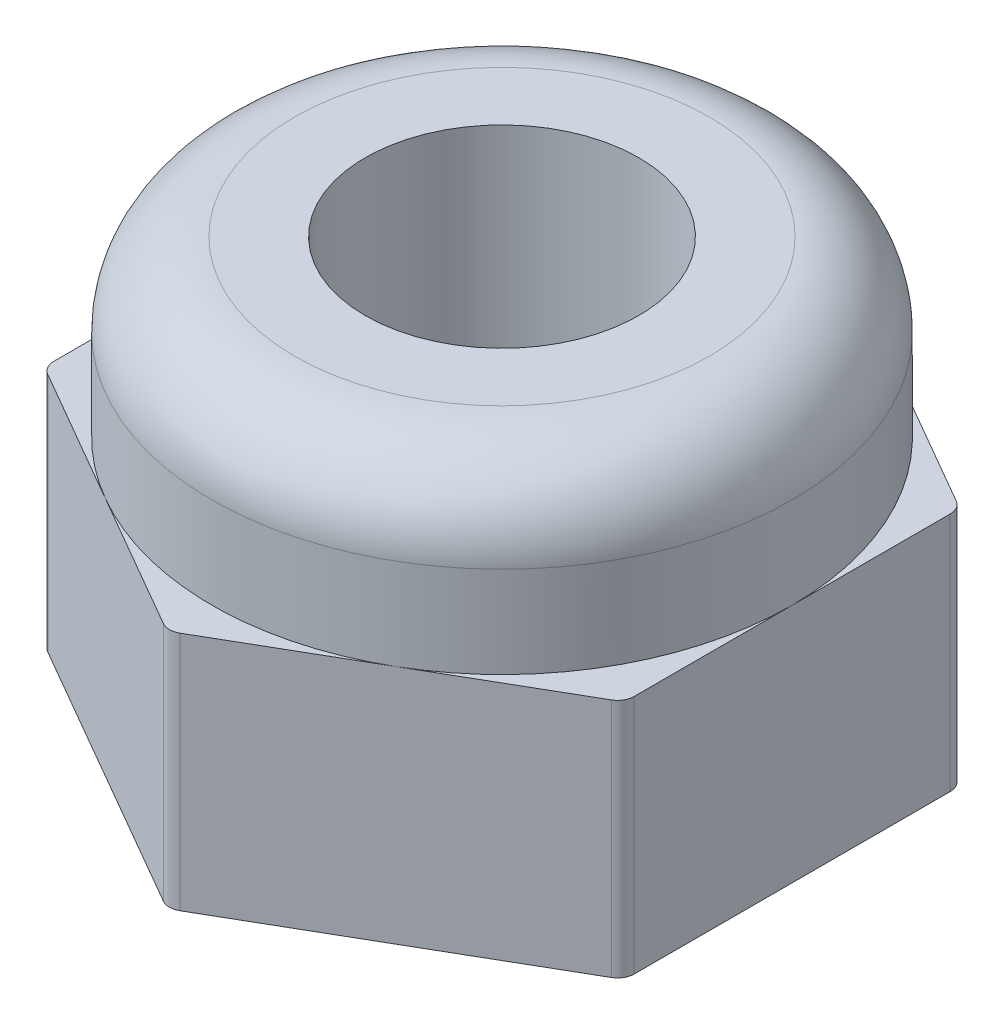
ISO-10303-21;
HEADER;
FILE_DESCRIPTION(('STEP AP214'),'2;1');
FILE_NAME('part.step','',(''),(''),'','','');
FILE_SCHEMA(('AUTOMOTIVE_DESIGN { 1 0 10303 214 1 1 1 1 }'));
ENDSEC;
DATA;
#1=APPLICATION_CONTEXT('core data for automotive mechanical design processes');
#2=APPLICATION_PROTOCOL_DEFINITION('international standard','automotive_design',2000,#1);
#3=PRODUCT_CONTEXT('',#1,'mechanical');
#4=PRODUCT('Part','Part','',(#3));
#5=PRODUCT_RELATED_PRODUCT_CATEGORY('part','',(#4));
#6=PRODUCT_DEFINITION_FORMATION('','',#4);
#7=PRODUCT_DEFINITION_CONTEXT('part definition',#1,'design');
#8=PRODUCT_DEFINITION('design','',#6,#7);
#9=PRODUCT_DEFINITION_SHAPE('','',#8);
#10=(LENGTH_UNIT() NAMED_UNIT(*) SI_UNIT(.MILLI.,.METRE.));
#11=(NAMED_UNIT(*) PLANE_ANGLE_UNIT() SI_UNIT($,.RADIAN.));
#12=(NAMED_UNIT(*) SI_UNIT($,.STERADIAN.) SOLID_ANGLE_UNIT());
#13=UNCERTAINTY_MEASURE_WITH_UNIT(LENGTH_MEASURE(1.E-05),#10,'distance_accuracy_value','');
#14=(GEOMETRIC_REPRESENTATION_CONTEXT(3) GLOBAL_UNCERTAINTY_ASSIGNED_CONTEXT((#13)) GLOBAL_UNIT_ASSIGNED_CONTEXT((#10,
#11,#12)) REPRESENTATION_CONTEXT('',''));
#15=CARTESIAN_POINT('',(0.,0.,0.));
#16=DIRECTION('',(0.,0.,1.));
#17=DIRECTION('',(1.,0.,0.));
#18=AXIS2_PLACEMENT_3D('',#15,#16,#17);
#19=CARTESIAN_POINT('',(0.,2.9,0.));
#20=DIRECTION('',(0.,1.,0.));
#21=DIRECTION('',(0.,0.,1.));
#22=AXIS2_PLACEMENT_3D('',#19,#20,#21);
#23=PLANE('',#22);
#24=DIRECTION('',(0.866025403784438,0.,-0.5));
#25=VECTOR('',#24,1.);
#26=CARTESIAN_POINT('',(0.,2.9,4.04145188432738));
#27=LINE('',#26,#25);
#28=CARTESIAN_POINT('',(1.75,2.9,3.03108891324553));
#29=VERTEX_POINT('',#28);
#30=CARTESIAN_POINT('',(3.4,2.9,2.07846096908265));
#31=VERTEX_POINT('',#30);
#32=EDGE_CURVE('E159',#29,#31,#27,.T.);
#33=ORIENTED_EDGE('',*,*,#32,.T.);
#34=CARTESIAN_POINT('',(3.3,2.9,1.90525588832576));
#35=DIRECTION('',(0.,1.,0.));
#36=DIRECTION('',(0.,0.,1.));
#37=AXIS2_PLACEMENT_3D('',#34,#35,#36);
#38=CIRCLE('',#37,0.2);
#39=CARTESIAN_POINT('',(3.5,2.9,1.90525588832576));
#40=VERTEX_POINT('',#39);
#41=EDGE_CURVE('E52',#31,#40,#38,.T.);
#42=ORIENTED_EDGE('',*,*,#41,.T.);
#43=DIRECTION('',(0.,0.,-1.));
#44=VECTOR('',#43,1.);
#45=CARTESIAN_POINT('',(3.5,2.9,2.02072594216369));
#46=LINE('',#45,#44);
#47=CARTESIAN_POINT('',(3.5,2.9,0.));
#48=VERTEX_POINT('',#47);
#49=EDGE_CURVE('E170',#40,#48,#46,.T.);
#50=ORIENTED_EDGE('',*,*,#49,.T.);
#51=CARTESIAN_POINT('',(0.,2.9,0.));
#52=DIRECTION('',(0.,1.,0.));
#53=DIRECTION('',(0.,0.,1.));
#54=AXIS2_PLACEMENT_3D('',#51,#52,#53);
#55=CIRCLE('',#54,3.5);
#56=EDGE_CURVE('E168',#29,#48,#55,.T.);
#57=ORIENTED_EDGE('',*,*,#56,.F.);
#58=EDGE_LOOP('',(#33,#42,#50,#57));
#59=FACE_BOUND('',#58,.T.);
#60=ADVANCED_FACE('F43',(#59),#23,.T.);
#61=CARTESIAN_POINT('',(3.5,2.9,-1.90525588832577));
#62=VERTEX_POINT('',#61);
#63=EDGE_CURVE('E196',#48,#62,#46,.T.);
#64=ORIENTED_EDGE('',*,*,#63,.T.);
#65=CARTESIAN_POINT('',(3.3,2.9,-1.90525588832576));
#66=DIRECTION('',(0.,1.,0.));
#67=DIRECTION('',(0.,0.,1.));
#68=AXIS2_PLACEMENT_3D('',#65,#66,#67);
#69=CIRCLE('',#68,0.2);
#70=CARTESIAN_POINT('',(3.4,2.9,-2.07846096908265));
#71=VERTEX_POINT('',#70);
#72=EDGE_CURVE('E302',#62,#71,#69,.T.);
#73=ORIENTED_EDGE('',*,*,#72,.T.);
#74=DIRECTION('',(-0.866025403784439,0.,-0.5));
#75=VECTOR('',#74,1.);
#76=CARTESIAN_POINT('',(3.5,2.9,-2.02072594216369));
#77=LINE('',#76,#75);
#78=CARTESIAN_POINT('',(1.75,2.9,-3.03108891324554));
#79=VERTEX_POINT('',#78);
#80=EDGE_CURVE('E197',#71,#79,#77,.T.);
#81=ORIENTED_EDGE('',*,*,#80,.T.);
#82=EDGE_CURVE('E176',#48,#79,#55,.T.);
#83=ORIENTED_EDGE('',*,*,#82,.F.);
#84=EDGE_LOOP('',(#64,#73,#81,#83));
#85=FACE_BOUND('',#84,.T.);
#86=ADVANCED_FACE('F366',(#85),#23,.T.);
#87=CARTESIAN_POINT('',(0.0999999999999985,2.9,-3.98371685740842));
#88=VERTEX_POINT('',#87);
#89=EDGE_CURVE('E195',#79,#88,#77,.T.);
#90=ORIENTED_EDGE('',*,*,#89,.T.);
#91=CARTESIAN_POINT('',(0.,2.9,-3.81051177665153));
#92=DIRECTION('',(0.,1.,0.));
#93=DIRECTION('',(0.,0.,1.));
#94=AXIS2_PLACEMENT_3D('',#91,#92,#93);
#95=CIRCLE('',#94,0.2);
#96=CARTESIAN_POINT('',(-0.100000000000001,2.9,-3.98371685740842));
#97=VERTEX_POINT('',#96);
#98=EDGE_CURVE('E292',#88,#97,#95,.T.);
#99=ORIENTED_EDGE('',*,*,#98,.T.);
#100=DIRECTION('',(-0.866025403784438,0.,0.5));
#101=VECTOR('',#100,1.);
#102=CARTESIAN_POINT('',(0.,2.9,-4.04145188432738));
#103=LINE('',#102,#101);
#104=CARTESIAN_POINT('',(-1.75,2.9,-3.03108891324553));
#105=VERTEX_POINT('',#104);
#106=EDGE_CURVE('E201',#97,#105,#103,.T.);
#107=ORIENTED_EDGE('',*,*,#106,.T.);
#108=EDGE_CURVE('E371',#79,#105,#55,.T.);
#109=ORIENTED_EDGE('',*,*,#108,.F.);
#110=EDGE_LOOP('',(#90,#99,#107,#109));
#111=FACE_BOUND('',#110,.T.);
#112=ADVANCED_FACE('F381',(#111),#23,.T.);
#113=CARTESIAN_POINT('',(-3.4,2.9,-2.07846096908265));
#114=VERTEX_POINT('',#113);
#115=EDGE_CURVE('E200',#105,#114,#103,.T.);
#116=ORIENTED_EDGE('',*,*,#115,.T.);
#117=CARTESIAN_POINT('',(-3.3,2.9,-1.90525588832576));
#118=DIRECTION('',(0.,1.,0.));
#119=DIRECTION('',(0.,0.,1.));
#120=AXIS2_PLACEMENT_3D('',#117,#118,#119);
#121=CIRCLE('',#120,0.2);
#122=CARTESIAN_POINT('',(-3.5,2.9,-1.90525588832576));
#123=VERTEX_POINT('',#122);
#124=EDGE_CURVE('E282',#114,#123,#121,.T.);
#125=ORIENTED_EDGE('',*,*,#124,.T.);
#126=DIRECTION('',(0.,0.,1.));
#127=VECTOR('',#126,1.);
#128=CARTESIAN_POINT('',(-3.5,2.9,-2.02072594216369));
#129=LINE('',#128,#127);
#130=CARTESIAN_POINT('',(-3.5,2.9,0.));
#131=VERTEX_POINT('',#130);
#132=EDGE_CURVE('E205',#123,#131,#129,.T.);
#133=ORIENTED_EDGE('',*,*,#132,.T.);
#134=EDGE_CURVE('E187',#105,#131,#55,.T.);
#135=ORIENTED_EDGE('',*,*,#134,.F.);
#136=EDGE_LOOP('',(#116,#125,#133,#135));
#137=FACE_BOUND('',#136,.T.);
#138=ADVANCED_FACE('F377',(#137),#23,.T.);
#139=CARTESIAN_POINT('',(-3.5,2.9,1.90525588832576));
#140=VERTEX_POINT('',#139);
#141=EDGE_CURVE('E204',#131,#140,#129,.T.);
#142=ORIENTED_EDGE('',*,*,#141,.T.);
#143=CARTESIAN_POINT('',(-3.3,2.9,1.90525588832576));
#144=DIRECTION('',(0.,1.,0.));
#145=DIRECTION('',(0.,0.,1.));
#146=AXIS2_PLACEMENT_3D('',#143,#144,#145);
#147=CIRCLE('',#146,0.2);
#148=CARTESIAN_POINT('',(-3.4,2.9,2.07846096908265));
#149=VERTEX_POINT('',#148);
#150=EDGE_CURVE('E272',#140,#149,#147,.T.);
#151=ORIENTED_EDGE('',*,*,#150,.T.);
#152=DIRECTION('',(0.866025403784439,0.,0.5));
#153=VECTOR('',#152,1.);
#154=CARTESIAN_POINT('',(-3.5,2.9,2.02072594216369));
#155=LINE('',#154,#153);
#156=CARTESIAN_POINT('',(-1.75,2.9,3.03108891324554));
#157=VERTEX_POINT('',#156);
#158=EDGE_CURVE('E166',#149,#157,#155,.T.);
#159=ORIENTED_EDGE('',*,*,#158,.T.);
#160=EDGE_CURVE('E182',#131,#157,#55,.T.);
#161=ORIENTED_EDGE('',*,*,#160,.F.);
#162=EDGE_LOOP('',(#142,#151,#159,#161));
#163=FACE_BOUND('',#162,.T.);
#164=ADVANCED_FACE('F388',(#163),#23,.T.);
#165=CARTESIAN_POINT('',(3.5,2.9,2.02072594216369));
#166=DIRECTION('',(-1.,0.,0.));
#167=DIRECTION('',(0.,0.,1.));
#168=AXIS2_PLACEMENT_3D('',#165,#166,#167);
#169=PLANE('',#168);
#170=DIRECTION('',(0.,0.,-1.));
#171=VECTOR('',#170,1.);
#172=CARTESIAN_POINT('',(3.5,0.,2.02072594216369));
#173=LINE('',#172,#171);
#174=CARTESIAN_POINT('',(3.5,0.,1.90525588832576));
#175=VERTEX_POINT('',#174);
#176=CARTESIAN_POINT('',(3.5,0.,-1.90525588832577));
#177=VERTEX_POINT('',#176);
#178=EDGE_CURVE('E175',#175,#177,#173,.T.);
#179=ORIENTED_EDGE('',*,*,#178,.T.);
#180=DIRECTION('',(0.,-1.,0.));
#181=VECTOR('',#180,1.);
#182=CARTESIAN_POINT('',(3.5,2.9,-1.90525588832577));
#183=LINE('',#182,#181);
#184=EDGE_CURVE('E299',#177,#62,#183,.F.);
#185=ORIENTED_EDGE('',*,*,#184,.T.);
#186=ORIENTED_EDGE('',*,*,#63,.F.);
#187=ORIENTED_EDGE('',*,*,#49,.F.);
#188=DIRECTION('',(0.,-1.,0.));
#189=VECTOR('',#188,1.);
#190=CARTESIAN_POINT('',(3.5,2.9,1.90525588832576));
#191=LINE('',#190,#189);
#192=EDGE_CURVE('E295',#40,#175,#191,.T.);
#193=ORIENTED_EDGE('',*,*,#192,.T.);
#194=EDGE_LOOP('',(#179,#185,#186,#187,#193));
#195=FACE_BOUND('',#194,.T.);
#196=ADVANCED_FACE('F314',(#195),#169,.F.);
#197=CARTESIAN_POINT('',(3.5,2.9,-2.02072594216369));
#198=DIRECTION('',(-0.5,0.,0.866025403784439));
#199=DIRECTION('',(0.866025403784439,0.,0.5));
#200=AXIS2_PLACEMENT_3D('',#197,#198,#199);
#201=PLANE('',#200);
#202=DIRECTION('',(-0.866025403784439,0.,-0.5));
#203=VECTOR('',#202,1.);
#204=CARTESIAN_POINT('',(3.5,0.,-2.02072594216369));
#205=LINE('',#204,#203);
#206=CARTESIAN_POINT('',(3.4,0.,-2.07846096908265));
#207=VERTEX_POINT('',#206);
#208=CARTESIAN_POINT('',(0.0999999999999985,0.,-3.98371685740842));
#209=VERTEX_POINT('',#208);
#210=EDGE_CURVE('E214',#207,#209,#205,.T.);
#211=ORIENTED_EDGE('',*,*,#210,.T.);
#212=DIRECTION('',(0.,-1.,0.));
#213=VECTOR('',#212,1.);
#214=CARTESIAN_POINT('',(0.099999999999999,2.9,-3.98371685740842));
#215=LINE('',#214,#213);
#216=EDGE_CURVE('E289',#209,#88,#215,.F.);
#217=ORIENTED_EDGE('',*,*,#216,.T.);
#218=ORIENTED_EDGE('',*,*,#89,.F.);
#219=ORIENTED_EDGE('',*,*,#80,.F.);
#220=DIRECTION('',(0.,-1.,0.));
#221=VECTOR('',#220,1.);
#222=CARTESIAN_POINT('',(3.4,2.9,-2.07846096908265));
#223=LINE('',#222,#221);
#224=EDGE_CURVE('E285',#71,#207,#223,.T.);
#225=ORIENTED_EDGE('',*,*,#224,.T.);
#226=EDGE_LOOP('',(#211,#217,#218,#219,#225));
#227=FACE_BOUND('',#226,.T.);
#228=ADVANCED_FACE('F356',(#227),#201,.F.);
#229=CARTESIAN_POINT('',(0.,2.9,-4.04145188432738));
#230=DIRECTION('',(0.5,0.,0.866025403784439));
#231=DIRECTION('',(0.866025403784439,0.,-0.5));
#232=AXIS2_PLACEMENT_3D('',#229,#230,#231);
#233=PLANE('',#232);
#234=DIRECTION('',(-0.866025403784438,0.,0.5));
#235=VECTOR('',#234,1.);
#236=CARTESIAN_POINT('',(0.,0.,-4.04145188432738));
#237=LINE('',#236,#235);
#238=CARTESIAN_POINT('',(-0.100000000000001,0.,-3.98371685740842));
#239=VERTEX_POINT('',#238);
#240=CARTESIAN_POINT('',(-3.4,0.,-2.07846096908265));
#241=VERTEX_POINT('',#240);
#242=EDGE_CURVE('E218',#239,#241,#237,.T.);
#243=ORIENTED_EDGE('',*,*,#242,.T.);
#244=DIRECTION('',(0.,-1.,0.));
#245=VECTOR('',#244,1.);
#246=CARTESIAN_POINT('',(-3.4,2.9,-2.07846096908265));
#247=LINE('',#246,#245);
#248=EDGE_CURVE('E279',#241,#114,#247,.F.);
#249=ORIENTED_EDGE('',*,*,#248,.T.);
#250=ORIENTED_EDGE('',*,*,#115,.F.);
#251=ORIENTED_EDGE('',*,*,#106,.F.);
#252=DIRECTION('',(0.,-1.,0.));
#253=VECTOR('',#252,1.);
#254=CARTESIAN_POINT('',(-0.100000000000001,2.9,-3.98371685740842));
#255=LINE('',#254,#253);
#256=EDGE_CURVE('E275',#97,#239,#255,.T.);
#257=ORIENTED_EDGE('',*,*,#256,.T.);
#258=EDGE_LOOP('',(#243,#249,#250,#251,#257));
#259=FACE_BOUND('',#258,.T.);
#260=ADVANCED_FACE('F345',(#259),#233,.F.);
#261=CARTESIAN_POINT('',(-3.5,2.9,-2.02072594216369));
#262=DIRECTION('',(1.,0.,0.));
#263=DIRECTION('',(0.,0.,-1.));
#264=AXIS2_PLACEMENT_3D('',#261,#262,#263);
#265=PLANE('',#264);
#266=DIRECTION('',(0.,0.,1.));
#267=VECTOR('',#266,1.);
#268=CARTESIAN_POINT('',(-3.5,0.,-2.02072594216369));
#269=LINE('',#268,#267);
#270=CARTESIAN_POINT('',(-3.5,0.,-1.90525588832576));
#271=VERTEX_POINT('',#270);
#272=CARTESIAN_POINT('',(-3.5,0.,1.90525588832576));
#273=VERTEX_POINT('',#272);
#274=EDGE_CURVE('E222',#271,#273,#269,.T.);
#275=ORIENTED_EDGE('',*,*,#274,.T.);
#276=DIRECTION('',(0.,-1.,0.));
#277=VECTOR('',#276,1.);
#278=CARTESIAN_POINT('',(-3.5,2.9,1.90525588832576));
#279=LINE('',#278,#277);
#280=EDGE_CURVE('E269',#273,#140,#279,.F.);
#281=ORIENTED_EDGE('',*,*,#280,.T.);
#282=ORIENTED_EDGE('',*,*,#141,.F.);
#283=ORIENTED_EDGE('',*,*,#132,.F.);
#284=DIRECTION('',(0.,-1.,0.));
#285=VECTOR('',#284,1.);
#286=CARTESIAN_POINT('',(-3.5,2.9,-1.90525588832576));
#287=LINE('',#286,#285);
#288=EDGE_CURVE('E265',#123,#271,#287,.T.);
#289=ORIENTED_EDGE('',*,*,#288,.T.);
#290=EDGE_LOOP('',(#275,#281,#282,#283,#289));
#291=FACE_BOUND('',#290,.T.);
#292=ADVANCED_FACE('F334',(#291),#265,.F.);
#293=CARTESIAN_POINT('',(-3.5,2.9,2.02072594216369));
#294=DIRECTION('',(0.5,0.,-0.866025403784439));
#295=DIRECTION('',(-0.866025403784439,0.,-0.5));
#296=AXIS2_PLACEMENT_3D('',#293,#294,#295);
#297=PLANE('',#296);
#298=ORIENTED_EDGE('',*,*,#158,.F.);
#299=DIRECTION('',(0.,-1.,0.));
#300=VECTOR('',#299,1.);
#301=CARTESIAN_POINT('',(-3.4,2.9,2.07846096908265));
#302=LINE('',#301,#300);
#303=CARTESIAN_POINT('',(-3.4,0.,2.07846096908265));
#304=VERTEX_POINT('',#303);
#305=EDGE_CURVE('E243',#149,#304,#302,.T.);
#306=ORIENTED_EDGE('',*,*,#305,.T.);
#307=DIRECTION('',(0.866025403784439,0.,0.5));
#308=VECTOR('',#307,1.);
#309=CARTESIAN_POINT('',(-3.5,0.,2.02072594216369));
#310=LINE('',#309,#308);
#311=CARTESIAN_POINT('',(-0.0999999999999972,0.,3.98371685740842));
#312=VERTEX_POINT('',#311);
#313=EDGE_CURVE('E226',#304,#312,#310,.T.);
#314=ORIENTED_EDGE('',*,*,#313,.T.);
#315=DIRECTION('',(0.,-1.,0.));
#316=VECTOR('',#315,1.);
#317=CARTESIAN_POINT('',(-0.0999999999999985,2.9,3.98371685740842));
#318=LINE('',#317,#316);
#319=CARTESIAN_POINT('',(-0.0999999999999972,2.9,3.98371685740842));
#320=VERTEX_POINT('',#319);
#321=EDGE_CURVE('E240',#312,#320,#318,.F.);
#322=ORIENTED_EDGE('',*,*,#321,.T.);
#323=EDGE_CURVE('E208',#157,#320,#155,.T.);
#324=ORIENTED_EDGE('',*,*,#323,.F.);
#325=EDGE_LOOP('',(#298,#306,#314,#322,#324));
#326=FACE_BOUND('',#325,.T.);
#327=ADVANCED_FACE('F326',(#326),#297,.F.);
#328=CARTESIAN_POINT('',(0.,2.9,4.04145188432738));
#329=DIRECTION('',(-0.5,0.,-0.866025403784439));
#330=DIRECTION('',(-0.866025403784439,0.,0.5));
#331=AXIS2_PLACEMENT_3D('',#328,#329,#330);
#332=PLANE('',#331);
#333=DIRECTION('',(0.866025403784438,0.,-0.5));
#334=VECTOR('',#333,1.);
#335=CARTESIAN_POINT('',(0.,0.,4.04145188432738));
#336=LINE('',#335,#334);
#337=CARTESIAN_POINT('',(0.100000000000001,0.,3.98371685740842));
#338=VERTEX_POINT('',#337);
#339=CARTESIAN_POINT('',(3.4,0.,2.07846096908265));
#340=VERTEX_POINT('',#339);
#341=EDGE_CURVE('E230',#338,#340,#336,.T.);
#342=ORIENTED_EDGE('',*,*,#341,.T.);
#343=DIRECTION('',(0.,-1.,0.));
#344=VECTOR('',#343,1.);
#345=CARTESIAN_POINT('',(3.4,2.9,2.07846096908265));
#346=LINE('',#345,#344);
#347=EDGE_CURVE('E65',#340,#31,#346,.F.);
#348=ORIENTED_EDGE('',*,*,#347,.T.);
#349=ORIENTED_EDGE('',*,*,#32,.F.);
#350=CARTESIAN_POINT('',(0.100000000000001,2.9,3.98371685740842));
#351=VERTEX_POINT('',#350);
#352=EDGE_CURVE('E150',#351,#29,#27,.T.);
#353=ORIENTED_EDGE('',*,*,#352,.F.);
#354=DIRECTION('',(0.,-1.,0.));
#355=VECTOR('',#354,1.);
#356=CARTESIAN_POINT('',(0.100000000000001,2.9,3.98371685740842));
#357=LINE('',#356,#355);
#358=EDGE_CURVE('E305',#351,#338,#357,.T.);
#359=ORIENTED_EDGE('',*,*,#358,.T.);
#360=EDGE_LOOP('',(#342,#348,#349,#353,#359));
#361=FACE_BOUND('',#360,.T.);
#362=ADVANCED_FACE('F162',(#361),#332,.F.);
#363=ORIENTED_EDGE('',*,*,#323,.T.);
#364=CARTESIAN_POINT('',(0.,2.9,3.81051177665153));
#365=DIRECTION('',(0.,1.,0.));
#366=DIRECTION('',(0.,0.,1.));
#367=AXIS2_PLACEMENT_3D('',#364,#365,#366);
#368=CIRCLE('',#367,0.2);
#369=EDGE_CURVE('E11',#320,#351,#368,.T.);
#370=ORIENTED_EDGE('',*,*,#369,.T.);
#371=ORIENTED_EDGE('',*,*,#352,.T.);
#372=EDGE_CURVE('E153',#157,#29,#55,.T.);
#373=ORIENTED_EDGE('',*,*,#372,.F.);
#374=EDGE_LOOP('',(#363,#370,#371,#373));
#375=FACE_BOUND('',#374,.T.);
#376=ADVANCED_FACE('F151',(#375),#23,.T.);
#377=CARTESIAN_POINT('',(0.,0.,0.));
#378=DIRECTION('',(0.,1.,0.));
#379=DIRECTION('',(0.,0.,1.));
#380=AXIS2_PLACEMENT_3D('',#377,#378,#379);
#381=PLANE('',#380);
#382=CARTESIAN_POINT('',(0.,0.,0.));
#383=DIRECTION('',(0.,-1.,0.));
#384=DIRECTION('',(0.,0.,-1.));
#385=AXIS2_PLACEMENT_3D('',#382,#383,#384);
#386=CIRCLE('',#385,1.65);
#387=CARTESIAN_POINT('',(0.,0.,-1.65));
#388=VERTEX_POINT('',#387);
#389=EDGE_CURVE('E189',#388,#388,#386,.T.);
#390=ORIENTED_EDGE('',*,*,#389,.F.);
#391=EDGE_LOOP('',(#390));
#392=FACE_BOUND('',#391,.T.);
#393=ORIENTED_EDGE('',*,*,#313,.F.);
#394=CARTESIAN_POINT('',(-3.3,0.,1.90525588832576));
#395=DIRECTION('',(0.,1.,0.));
#396=DIRECTION('',(0.,0.,1.));
#397=AXIS2_PLACEMENT_3D('',#394,#395,#396);
#398=CIRCLE('',#397,0.2);
#399=EDGE_CURVE('E262',#304,#273,#398,.F.);
#400=ORIENTED_EDGE('',*,*,#399,.T.);
#401=ORIENTED_EDGE('',*,*,#274,.F.);
#402=CARTESIAN_POINT('',(-3.3,0.,-1.90525588832576));
#403=DIRECTION('',(0.,1.,0.));
#404=DIRECTION('',(0.,0.,1.));
#405=AXIS2_PLACEMENT_3D('',#402,#403,#404);
#406=CIRCLE('',#405,0.2);
#407=EDGE_CURVE('E259',#271,#241,#406,.F.);
#408=ORIENTED_EDGE('',*,*,#407,.T.);
#409=ORIENTED_EDGE('',*,*,#242,.F.);
#410=CARTESIAN_POINT('',(0.,0.,-3.81051177665153));
#411=DIRECTION('',(0.,1.,0.));
#412=DIRECTION('',(0.,0.,1.));
#413=AXIS2_PLACEMENT_3D('',#410,#411,#412);
#414=CIRCLE('',#413,0.2);
#415=EDGE_CURVE('E256',#239,#209,#414,.F.);
#416=ORIENTED_EDGE('',*,*,#415,.T.);
#417=ORIENTED_EDGE('',*,*,#210,.F.);
#418=CARTESIAN_POINT('',(3.3,0.,-1.90525588832576));
#419=DIRECTION('',(0.,1.,0.));
#420=DIRECTION('',(0.,0.,1.));
#421=AXIS2_PLACEMENT_3D('',#418,#419,#420);
#422=CIRCLE('',#421,0.2);
#423=EDGE_CURVE('E253',#207,#177,#422,.F.);
#424=ORIENTED_EDGE('',*,*,#423,.T.);
#425=ORIENTED_EDGE('',*,*,#178,.F.);
#426=CARTESIAN_POINT('',(3.3,0.,1.90525588832576));
#427=DIRECTION('',(0.,1.,0.));
#428=DIRECTION('',(0.,0.,1.));
#429=AXIS2_PLACEMENT_3D('',#426,#427,#428);
#430=CIRCLE('',#429,0.2);
#431=EDGE_CURVE('E250',#175,#340,#430,.F.);
#432=ORIENTED_EDGE('',*,*,#431,.T.);
#433=ORIENTED_EDGE('',*,*,#341,.F.);
#434=CARTESIAN_POINT('',(0.,0.,3.81051177665153));
#435=DIRECTION('',(0.,1.,0.));
#436=DIRECTION('',(0.,0.,1.));
#437=AXIS2_PLACEMENT_3D('',#434,#435,#436);
#438=CIRCLE('',#437,0.2);
#439=EDGE_CURVE('E247',#338,#312,#438,.F.);
#440=ORIENTED_EDGE('',*,*,#439,.T.);
#441=EDGE_LOOP('',(#393,#400,#401,#408,#409,#416,#417,#424,#425,#432,#433,#440));
#442=FACE_BOUND('',#441,.T.);
#443=ADVANCED_FACE('F321',(#392,#442),#381,.F.);
#444=CARTESIAN_POINT('',(0.,5.,0.));
#445=DIRECTION('',(0.,-1.,0.));
#446=DIRECTION('',(0.,0.,-1.));
#447=AXIS2_PLACEMENT_3D('',#444,#445,#446);
#448=CYLINDRICAL_SURFACE('',#447,3.5);
#449=CARTESIAN_POINT('',(0.,4.,0.));
#450=DIRECTION('',(0.,-1.,0.));
#451=DIRECTION('',(0.,0.,-1.));
#452=AXIS2_PLACEMENT_3D('',#449,#450,#451);
#453=CIRCLE('',#452,3.5);
#454=CARTESIAN_POINT('',(0.,4.,-3.5));
#455=VERTEX_POINT('',#454);
#456=EDGE_CURVE('E158',#455,#455,#453,.T.);
#457=ORIENTED_EDGE('',*,*,#456,.T.);
#458=EDGE_LOOP('',(#457));
#459=FACE_BOUND('',#458,.T.);
#460=ORIENTED_EDGE('',*,*,#372,.T.);
#461=ORIENTED_EDGE('',*,*,#56,.T.);
#462=ORIENTED_EDGE('',*,*,#82,.T.);
#463=ORIENTED_EDGE('',*,*,#108,.T.);
#464=ORIENTED_EDGE('',*,*,#134,.T.);
#465=ORIENTED_EDGE('',*,*,#160,.T.);
#466=EDGE_LOOP('',(#460,#461,#462,#463,#464,#465));
#467=FACE_BOUND('',#466,.T.);
#468=ADVANCED_FACE('F179',(#459,#467),#448,.T.);
#469=CARTESIAN_POINT('',(0.,5.,0.));
#470=DIRECTION('',(0.,-1.,0.));
#471=DIRECTION('',(0.,0.,-1.));
#472=AXIS2_PLACEMENT_3D('',#469,#470,#471);
#473=PLANE('',#472);
#474=CARTESIAN_POINT('',(0.,5.,0.));
#475=DIRECTION('',(0.,-1.,0.));
#476=DIRECTION('',(0.,0.,-1.));
#477=AXIS2_PLACEMENT_3D('',#474,#475,#476);
#478=CIRCLE('',#477,1.65);
#479=CARTESIAN_POINT('',(0.,5.,-1.65));
#480=VERTEX_POINT('',#479);
#481=EDGE_CURVE('E184',#480,#480,#478,.T.);
#482=ORIENTED_EDGE('',*,*,#481,.T.);
#483=EDGE_LOOP('',(#482));
#484=FACE_BOUND('',#483,.T.);
#485=CARTESIAN_POINT('',(0.,5.,0.));
#486=DIRECTION('',(0.,-1.,0.));
#487=DIRECTION('',(0.,0.,-1.));
#488=AXIS2_PLACEMENT_3D('',#485,#486,#487);
#489=CIRCLE('',#488,2.5);
#490=CARTESIAN_POINT('',(0.,5.,-2.5));
#491=VERTEX_POINT('',#490);
#492=EDGE_CURVE('E236',#491,#491,#489,.F.);
#493=ORIENTED_EDGE('',*,*,#492,.T.);
#494=EDGE_LOOP('',(#493));
#495=FACE_BOUND('',#494,.T.);
#496=ADVANCED_FACE('F417',(#484,#495),#473,.F.);
#497=CARTESIAN_POINT('',(0.,4.,0.));
#498=DIRECTION('',(0.,-1.,0.));
#499=DIRECTION('',(0.,0.,-1.));
#500=AXIS2_PLACEMENT_3D('',#497,#498,#499);
#501=TOROIDAL_SURFACE('',#500,2.5,1.);
#502=ORIENTED_EDGE('',*,*,#492,.F.);
#503=EDGE_LOOP('',(#502));
#504=FACE_BOUND('',#503,.T.);
#505=ORIENTED_EDGE('',*,*,#456,.F.);
#506=EDGE_LOOP('',(#505));
#507=FACE_BOUND('',#506,.T.);
#508=ADVANCED_FACE('F414',(#504,#507),#501,.T.);
#509=CARTESIAN_POINT('',(-3.3,2.9,1.90525588832576));
#510=DIRECTION('',(0.,-1.,0.));
#511=DIRECTION('',(0.,0.,-1.));
#512=AXIS2_PLACEMENT_3D('',#509,#510,#511);
#513=CYLINDRICAL_SURFACE('',#512,0.2);
#514=ORIENTED_EDGE('',*,*,#150,.F.);
#515=ORIENTED_EDGE('',*,*,#280,.F.);
#516=ORIENTED_EDGE('',*,*,#399,.F.);
#517=ORIENTED_EDGE('',*,*,#305,.F.);
#518=EDGE_LOOP('',(#514,#515,#516,#517));
#519=FACE_BOUND('',#518,.T.);
#520=ADVANCED_FACE('F330',(#519),#513,.T.);
#521=CARTESIAN_POINT('',(-3.3,2.9,-1.90525588832576));
#522=DIRECTION('',(0.,-1.,0.));
#523=DIRECTION('',(0.,0.,-1.));
#524=AXIS2_PLACEMENT_3D('',#521,#522,#523);
#525=CYLINDRICAL_SURFACE('',#524,0.2);
#526=ORIENTED_EDGE('',*,*,#124,.F.);
#527=ORIENTED_EDGE('',*,*,#248,.F.);
#528=ORIENTED_EDGE('',*,*,#407,.F.);
#529=ORIENTED_EDGE('',*,*,#288,.F.);
#530=EDGE_LOOP('',(#526,#527,#528,#529));
#531=FACE_BOUND('',#530,.T.);
#532=ADVANCED_FACE('F341',(#531),#525,.T.);
#533=CARTESIAN_POINT('',(0.,2.9,-3.81051177665153));
#534=DIRECTION('',(0.,-1.,0.));
#535=DIRECTION('',(0.,0.,-1.));
#536=AXIS2_PLACEMENT_3D('',#533,#534,#535);
#537=CYLINDRICAL_SURFACE('',#536,0.2);
#538=ORIENTED_EDGE('',*,*,#98,.F.);
#539=ORIENTED_EDGE('',*,*,#216,.F.);
#540=ORIENTED_EDGE('',*,*,#415,.F.);
#541=ORIENTED_EDGE('',*,*,#256,.F.);
#542=EDGE_LOOP('',(#538,#539,#540,#541));
#543=FACE_BOUND('',#542,.T.);
#544=ADVANCED_FACE('F352',(#543),#537,.T.);
#545=CARTESIAN_POINT('',(3.3,2.9,-1.90525588832576));
#546=DIRECTION('',(0.,-1.,0.));
#547=DIRECTION('',(0.,0.,-1.));
#548=AXIS2_PLACEMENT_3D('',#545,#546,#547);
#549=CYLINDRICAL_SURFACE('',#548,0.2);
#550=ORIENTED_EDGE('',*,*,#72,.F.);
#551=ORIENTED_EDGE('',*,*,#184,.F.);
#552=ORIENTED_EDGE('',*,*,#423,.F.);
#553=ORIENTED_EDGE('',*,*,#224,.F.);
#554=EDGE_LOOP('',(#550,#551,#552,#553));
#555=FACE_BOUND('',#554,.T.);
#556=ADVANCED_FACE('F363',(#555),#549,.T.);
#557=CARTESIAN_POINT('',(3.3,2.9,1.90525588832576));
#558=DIRECTION('',(0.,-1.,0.));
#559=DIRECTION('',(0.,0.,-1.));
#560=AXIS2_PLACEMENT_3D('',#557,#558,#559);
#561=CYLINDRICAL_SURFACE('',#560,0.2);
#562=ORIENTED_EDGE('',*,*,#41,.F.);
#563=ORIENTED_EDGE('',*,*,#347,.F.);
#564=ORIENTED_EDGE('',*,*,#431,.F.);
#565=ORIENTED_EDGE('',*,*,#192,.F.);
#566=EDGE_LOOP('',(#562,#563,#564,#565));
#567=FACE_BOUND('',#566,.T.);
#568=ADVANCED_FACE('F317',(#567),#561,.T.);
#569=CARTESIAN_POINT('',(0.,2.9,3.81051177665153));
#570=DIRECTION('',(0.,-1.,0.));
#571=DIRECTION('',(0.,0.,-1.));
#572=AXIS2_PLACEMENT_3D('',#569,#570,#571);
#573=CYLINDRICAL_SURFACE('',#572,0.2);
#574=ORIENTED_EDGE('',*,*,#369,.F.);
#575=ORIENTED_EDGE('',*,*,#321,.F.);
#576=ORIENTED_EDGE('',*,*,#439,.F.);
#577=ORIENTED_EDGE('',*,*,#358,.F.);
#578=EDGE_LOOP('',(#574,#575,#576,#577));
#579=FACE_BOUND('',#578,.T.);
#580=ADVANCED_FACE('F45',(#579),#573,.T.);
#581=CARTESIAN_POINT('',(0.,0.,0.));
#582=DIRECTION('',(0.,-1.,0.));
#583=DIRECTION('',(0.,0.,-1.));
#584=AXIS2_PLACEMENT_3D('',#581,#582,#583);
#585=CYLINDRICAL_SURFACE('',#584,1.65);
#586=ORIENTED_EDGE('',*,*,#389,.T.);
#587=EDGE_LOOP('',(#586));
#588=FACE_BOUND('',#587,.T.);
#589=ORIENTED_EDGE('',*,*,#481,.F.);
#590=EDGE_LOOP('',(#589));
#591=FACE_BOUND('',#590,.T.);
#592=ADVANCED_FACE('F430',(#588,#591),#585,.F.);
#593=CLOSED_SHELL('',(#60,#86,#112,#138,#164,#196,#228,#260,#292,#327,#362,#376,#443,#468,#496,
#508,#520,#532,#544,#556,#568,#580,#592));
#594=MANIFOLD_SOLID_BREP('B2',#593);
#595=ADVANCED_BREP_SHAPE_REPRESENTATION('',(#18,#594),#14);
#596=SHAPE_DEFINITION_REPRESENTATION(#9,#595);
ENDSEC;
END-ISO-10303-21;
